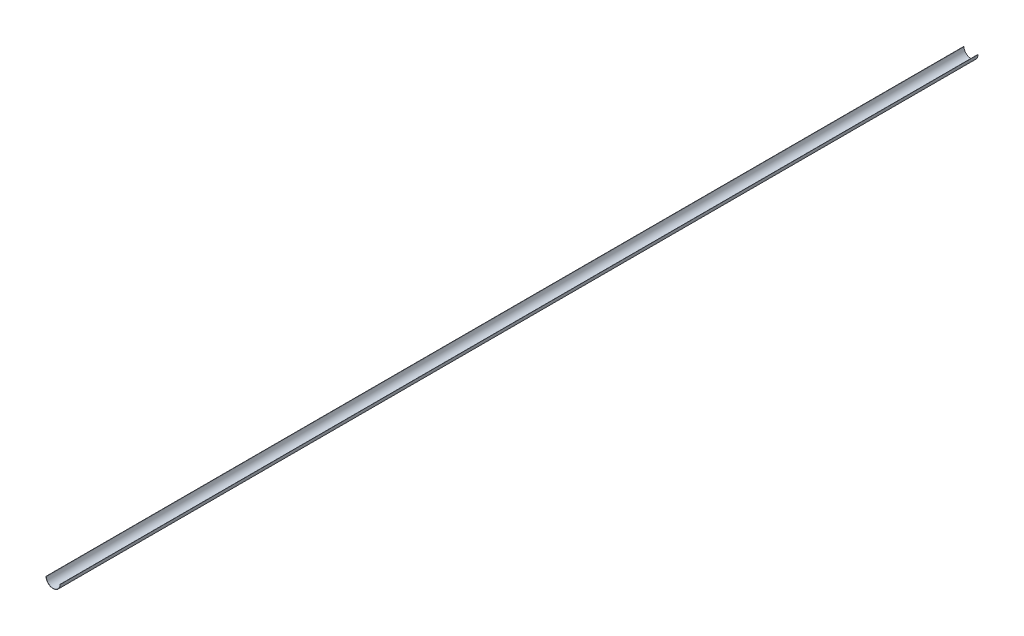
ISO-10303-21;
HEADER;
FILE_DESCRIPTION(('STEP AP214'),'2;1');
FILE_NAME('part.step','',(''),(''),'','','');
FILE_SCHEMA(('AUTOMOTIVE_DESIGN { 1 0 10303 214 1 1 1 1 }'));
ENDSEC;
DATA;
#1=APPLICATION_CONTEXT('core data for automotive mechanical design processes');
#2=APPLICATION_PROTOCOL_DEFINITION('international standard','automotive_design',2000,#1);
#3=PRODUCT_CONTEXT('',#1,'mechanical');
#4=PRODUCT('Part','Part','',(#3));
#5=PRODUCT_RELATED_PRODUCT_CATEGORY('part','',(#4));
#6=PRODUCT_DEFINITION_FORMATION('','',#4);
#7=PRODUCT_DEFINITION_CONTEXT('part definition',#1,'design');
#8=PRODUCT_DEFINITION('design','',#6,#7);
#9=PRODUCT_DEFINITION_SHAPE('','',#8);
#10=(LENGTH_UNIT() NAMED_UNIT(*) SI_UNIT(.MILLI.,.METRE.));
#11=(NAMED_UNIT(*) PLANE_ANGLE_UNIT() SI_UNIT($,.RADIAN.));
#12=(NAMED_UNIT(*) SI_UNIT($,.STERADIAN.) SOLID_ANGLE_UNIT());
#13=UNCERTAINTY_MEASURE_WITH_UNIT(LENGTH_MEASURE(1.E-05),#10,'distance_accuracy_value','');
#14=(GEOMETRIC_REPRESENTATION_CONTEXT(3) GLOBAL_UNCERTAINTY_ASSIGNED_CONTEXT((#13)) GLOBAL_UNIT_ASSIGNED_CONTEXT((#10,
#11,#12)) REPRESENTATION_CONTEXT('',''));
#15=CARTESIAN_POINT('',(0.,0.,0.));
#16=DIRECTION('',(0.,0.,1.));
#17=DIRECTION('',(1.,0.,0.));
#18=AXIS2_PLACEMENT_3D('',#15,#16,#17);
#19=CARTESIAN_POINT('',(0.,0.,1000.));
#20=DIRECTION('',(0.,0.,-1.));
#21=DIRECTION('',(-1.,0.,0.));
#22=AXIS2_PLACEMENT_3D('',#19,#20,#21);
#23=CYLINDRICAL_SURFACE('',#22,7.5);
#24=CARTESIAN_POINT('',(0.,0.,0.));
#25=DIRECTION('',(0.,0.,-1.));
#26=DIRECTION('',(1.,0.,0.));
#27=AXIS2_PLACEMENT_3D('',#24,#25,#26);
#28=CIRCLE('',#27,7.5);
#29=CARTESIAN_POINT('',(7.5,0.,0.));
#30=VERTEX_POINT('',#29);
#31=CARTESIAN_POINT('',(-7.5,0.,0.));
#32=VERTEX_POINT('',#31);
#33=EDGE_CURVE('E100',#30,#32,#28,.T.);
#34=ORIENTED_EDGE('',*,*,#33,.T.);
#35=DIRECTION('',(0.,0.,-1.));
#36=VECTOR('',#35,1.);
#37=CARTESIAN_POINT('',(-7.5,0.,1000.));
#38=LINE('',#37,#36);
#39=CARTESIAN_POINT('',(-7.5,0.,1000.));
#40=VERTEX_POINT('',#39);
#41=EDGE_CURVE('E11',#40,#32,#38,.T.);
#42=ORIENTED_EDGE('',*,*,#41,.F.);
#43=CARTESIAN_POINT('',(0.,0.,1000.));
#44=DIRECTION('',(0.,0.,-1.));
#45=DIRECTION('',(1.,0.,0.));
#46=AXIS2_PLACEMENT_3D('',#43,#44,#45);
#47=CIRCLE('',#46,7.5);
#48=CARTESIAN_POINT('',(7.5,0.,1000.));
#49=VERTEX_POINT('',#48);
#50=EDGE_CURVE('E88',#49,#40,#47,.T.);
#51=ORIENTED_EDGE('',*,*,#50,.F.);
#52=DIRECTION('',(0.,0.,-1.));
#53=VECTOR('',#52,1.);
#54=CARTESIAN_POINT('',(7.5,0.,1000.));
#55=LINE('',#54,#53);
#56=EDGE_CURVE('E96',#49,#30,#55,.T.);
#57=ORIENTED_EDGE('',*,*,#56,.T.);
#58=EDGE_LOOP('',(#34,#42,#51,#57));
#59=FACE_BOUND('',#58,.T.);
#60=ADVANCED_FACE('F37',(#59),#23,.F.);
#61=CARTESIAN_POINT('',(-7.75,0.,1000.));
#62=DIRECTION('',(0.,-1.,0.));
#63=DIRECTION('',(0.,0.,-1.));
#64=AXIS2_PLACEMENT_3D('',#61,#62,#63);
#65=PLANE('',#64);
#66=DIRECTION('',(-1.,0.,0.));
#67=VECTOR('',#66,1.);
#68=CARTESIAN_POINT('',(-7.75,0.,0.));
#69=LINE('',#68,#67);
#70=CARTESIAN_POINT('',(-7.75,0.,0.));
#71=VERTEX_POINT('',#70);
#72=EDGE_CURVE('E92',#32,#71,#69,.T.);
#73=ORIENTED_EDGE('',*,*,#72,.T.);
#74=DIRECTION('',(0.,0.,-1.));
#75=VECTOR('',#74,1.);
#76=CARTESIAN_POINT('',(-7.75,0.,1000.));
#77=LINE('',#76,#75);
#78=CARTESIAN_POINT('',(-7.75,0.,1000.));
#79=VERTEX_POINT('',#78);
#80=EDGE_CURVE('E45',#79,#71,#77,.T.);
#81=ORIENTED_EDGE('',*,*,#80,.F.);
#82=DIRECTION('',(-1.,0.,0.));
#83=VECTOR('',#82,1.);
#84=CARTESIAN_POINT('',(-7.75,0.,1000.));
#85=LINE('',#84,#83);
#86=EDGE_CURVE('E83',#40,#79,#85,.T.);
#87=ORIENTED_EDGE('',*,*,#86,.F.);
#88=ORIENTED_EDGE('',*,*,#41,.T.);
#89=EDGE_LOOP('',(#73,#81,#87,#88));
#90=FACE_BOUND('',#89,.T.);
#91=ADVANCED_FACE('F91',(#90),#65,.F.);
#92=CARTESIAN_POINT('',(0.,0.,1000.));
#93=DIRECTION('',(0.,0.,-1.));
#94=DIRECTION('',(-1.,0.,0.));
#95=AXIS2_PLACEMENT_3D('',#92,#93,#94);
#96=CYLINDRICAL_SURFACE('',#95,7.75);
#97=CARTESIAN_POINT('',(0.,0.,0.));
#98=DIRECTION('',(0.,0.,1.));
#99=DIRECTION('',(1.,0.,0.));
#100=AXIS2_PLACEMENT_3D('',#97,#98,#99);
#101=CIRCLE('',#100,7.75);
#102=CARTESIAN_POINT('',(7.75,0.,0.));
#103=VERTEX_POINT('',#102);
#104=EDGE_CURVE('E70',#71,#103,#101,.T.);
#105=ORIENTED_EDGE('',*,*,#104,.T.);
#106=DIRECTION('',(0.,0.,-1.));
#107=VECTOR('',#106,1.);
#108=CARTESIAN_POINT('',(7.75,0.,1000.));
#109=LINE('',#108,#107);
#110=CARTESIAN_POINT('',(7.75,0.,1000.));
#111=VERTEX_POINT('',#110);
#112=EDGE_CURVE('E93',#111,#103,#109,.T.);
#113=ORIENTED_EDGE('',*,*,#112,.F.);
#114=CARTESIAN_POINT('',(0.,0.,1000.));
#115=DIRECTION('',(0.,0.,1.));
#116=DIRECTION('',(1.,0.,0.));
#117=AXIS2_PLACEMENT_3D('',#114,#115,#116);
#118=CIRCLE('',#117,7.75);
#119=EDGE_CURVE('E86',#79,#111,#118,.T.);
#120=ORIENTED_EDGE('',*,*,#119,.F.);
#121=ORIENTED_EDGE('',*,*,#80,.T.);
#122=EDGE_LOOP('',(#105,#113,#120,#121));
#123=FACE_BOUND('',#122,.T.);
#124=ADVANCED_FACE('F94',(#123),#96,.T.);
#125=CARTESIAN_POINT('',(7.5,0.,1000.));
#126=DIRECTION('',(0.,-1.,0.));
#127=DIRECTION('',(0.,0.,-1.));
#128=AXIS2_PLACEMENT_3D('',#125,#126,#127);
#129=PLANE('',#128);
#130=DIRECTION('',(-1.,0.,0.));
#131=VECTOR('',#130,1.);
#132=CARTESIAN_POINT('',(7.5,0.,0.));
#133=LINE('',#132,#131);
#134=EDGE_CURVE('E76',#103,#30,#133,.T.);
#135=ORIENTED_EDGE('',*,*,#134,.T.);
#136=ORIENTED_EDGE('',*,*,#56,.F.);
#137=DIRECTION('',(-1.,0.,0.));
#138=VECTOR('',#137,1.);
#139=CARTESIAN_POINT('',(7.5,0.,1000.));
#140=LINE('',#139,#138);
#141=EDGE_CURVE('E53',#111,#49,#140,.T.);
#142=ORIENTED_EDGE('',*,*,#141,.F.);
#143=ORIENTED_EDGE('',*,*,#112,.T.);
#144=EDGE_LOOP('',(#135,#136,#142,#143));
#145=FACE_BOUND('',#144,.T.);
#146=ADVANCED_FACE('F107',(#145),#129,.F.);
#147=CARTESIAN_POINT('',(0.,0.,1000.));
#148=DIRECTION('',(0.,0.,1.));
#149=DIRECTION('',(1.,0.,0.));
#150=AXIS2_PLACEMENT_3D('',#147,#148,#149);
#151=PLANE('',#150);
#152=ORIENTED_EDGE('',*,*,#50,.T.);
#153=ORIENTED_EDGE('',*,*,#86,.T.);
#154=ORIENTED_EDGE('',*,*,#119,.T.);
#155=ORIENTED_EDGE('',*,*,#141,.T.);
#156=EDGE_LOOP('',(#152,#153,#154,#155));
#157=FACE_BOUND('',#156,.T.);
#158=ADVANCED_FACE('F84',(#157),#151,.T.);
#159=CARTESIAN_POINT('',(0.,0.,0.));
#160=DIRECTION('',(0.,0.,1.));
#161=DIRECTION('',(1.,0.,0.));
#162=AXIS2_PLACEMENT_3D('',#159,#160,#161);
#163=PLANE('',#162);
#164=ORIENTED_EDGE('',*,*,#33,.F.);
#165=ORIENTED_EDGE('',*,*,#134,.F.);
#166=ORIENTED_EDGE('',*,*,#104,.F.);
#167=ORIENTED_EDGE('',*,*,#72,.F.);
#168=EDGE_LOOP('',(#164,#165,#166,#167));
#169=FACE_BOUND('',#168,.T.);
#170=ADVANCED_FACE('F110',(#169),#163,.F.);
#171=CLOSED_SHELL('',(#60,#91,#124,#146,#158,#170));
#172=MANIFOLD_SOLID_BREP('B2',#171);
#173=ADVANCED_BREP_SHAPE_REPRESENTATION('',(#18,#172),#14);
#174=SHAPE_DEFINITION_REPRESENTATION(#9,#173);
ENDSEC;
END-ISO-10303-21;
